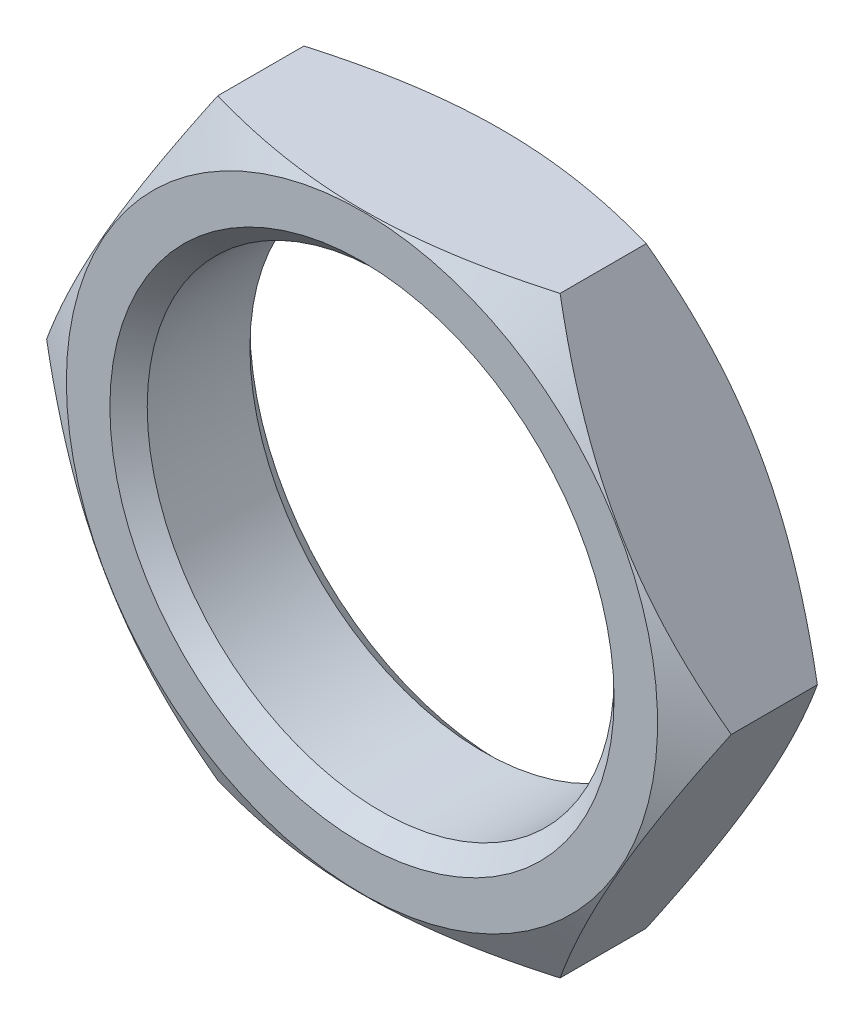
ISO-10303-21;
HEADER;
FILE_DESCRIPTION(('STEP AP214'),'2;1');
FILE_NAME('part.step','',(''),(''),'','','');
FILE_SCHEMA(('AUTOMOTIVE_DESIGN { 1 0 10303 214 1 1 1 1 }'));
ENDSEC;
DATA;
#1=APPLICATION_CONTEXT('core data for automotive mechanical design processes');
#2=APPLICATION_PROTOCOL_DEFINITION('international standard','automotive_design',2000,#1);
#3=PRODUCT_CONTEXT('',#1,'mechanical');
#4=PRODUCT('Part','Part','',(#3));
#5=PRODUCT_RELATED_PRODUCT_CATEGORY('part','',(#4));
#6=PRODUCT_DEFINITION_FORMATION('','',#4);
#7=PRODUCT_DEFINITION_CONTEXT('part definition',#1,'design');
#8=PRODUCT_DEFINITION('design','',#6,#7);
#9=PRODUCT_DEFINITION_SHAPE('','',#8);
#10=(LENGTH_UNIT() NAMED_UNIT(*) SI_UNIT(.MILLI.,.METRE.));
#11=(NAMED_UNIT(*) PLANE_ANGLE_UNIT() SI_UNIT($,.RADIAN.));
#12=(NAMED_UNIT(*) SI_UNIT($,.STERADIAN.) SOLID_ANGLE_UNIT());
#13=UNCERTAINTY_MEASURE_WITH_UNIT(LENGTH_MEASURE(1.E-05),#10,'distance_accuracy_value','');
#14=(GEOMETRIC_REPRESENTATION_CONTEXT(3) GLOBAL_UNCERTAINTY_ASSIGNED_CONTEXT((#13)) GLOBAL_UNIT_ASSIGNED_CONTEXT((#10,
#11,#12)) REPRESENTATION_CONTEXT('',''));
#15=CARTESIAN_POINT('',(0.,0.,0.));
#16=DIRECTION('',(0.,0.,1.));
#17=DIRECTION('',(1.,0.,0.));
#18=AXIS2_PLACEMENT_3D('',#15,#16,#17);
#19=CARTESIAN_POINT('',(3.66617420935412,0.,1.5));
#20=DIRECTION('',(0.,0.,1.));
#21=DIRECTION('',(1.,0.,0.));
#22=AXIS2_PLACEMENT_3D('',#19,#20,#21);
#23=PLANE('',#22);
#24=CARTESIAN_POINT('',(0.,0.,1.5));
#25=DIRECTION('',(0.,0.,1.));
#26=DIRECTION('',(1.,0.,0.));
#27=AXIS2_PLACEMENT_3D('',#24,#25,#26);
#28=CIRCLE('',#27,2.7);
#29=CARTESIAN_POINT('',(2.7,0.,1.5));
#30=VERTEX_POINT('',#29);
#31=EDGE_CURVE('E43',#30,#30,#28,.F.);
#32=ORIENTED_EDGE('',*,*,#31,.T.);
#33=EDGE_LOOP('',(#32));
#34=FACE_BOUND('',#33,.T.);
#35=CARTESIAN_POINT('',(0.,0.,1.5));
#36=DIRECTION('',(0.,0.,-1.));
#37=DIRECTION('',(-1.,0.,0.));
#38=AXIS2_PLACEMENT_3D('',#35,#36,#37);
#39=CIRCLE('',#38,3.16617420935412);
#40=CARTESIAN_POINT('',(-3.16617420935412,0.,1.5));
#41=VERTEX_POINT('',#40);
#42=EDGE_CURVE('E290',#41,#41,#39,.T.);
#43=ORIENTED_EDGE('',*,*,#42,.F.);
#44=EDGE_LOOP('',(#43));
#45=FACE_BOUND('',#44,.T.);
#46=ADVANCED_FACE('F35',(#34,#45),#23,.T.);
#47=CARTESIAN_POINT('',(3.66617420935412,0.,0.));
#48=DIRECTION('',(0.,0.,1.));
#49=DIRECTION('',(1.,0.,0.));
#50=AXIS2_PLACEMENT_3D('',#47,#48,#49);
#51=PLANE('',#50);
#52=CARTESIAN_POINT('',(0.,0.,0.));
#53=DIRECTION('',(0.,0.,1.));
#54=DIRECTION('',(1.,0.,0.));
#55=AXIS2_PLACEMENT_3D('',#52,#53,#54);
#56=CIRCLE('',#55,2.7);
#57=CARTESIAN_POINT('',(-2.7,0.,0.));
#58=VERTEX_POINT('',#57);
#59=EDGE_CURVE('E11',#58,#58,#56,.T.);
#60=ORIENTED_EDGE('',*,*,#59,.T.);
#61=EDGE_LOOP('',(#60));
#62=FACE_BOUND('',#61,.T.);
#63=CARTESIAN_POINT('',(0.,0.,0.));
#64=DIRECTION('',(0.,0.,-1.));
#65=DIRECTION('',(-1.,0.,0.));
#66=AXIS2_PLACEMENT_3D('',#63,#64,#65);
#67=CIRCLE('',#66,3.16617420935412);
#68=CARTESIAN_POINT('',(-3.16617420935412,0.,0.));
#69=VERTEX_POINT('',#68);
#70=EDGE_CURVE('E103',#69,#69,#67,.T.);
#71=ORIENTED_EDGE('',*,*,#70,.T.);
#72=EDGE_LOOP('',(#71));
#73=FACE_BOUND('',#72,.T.);
#74=ADVANCED_FACE('F142',(#62,#73),#51,.F.);
#75=CARTESIAN_POINT('',(0.,0.,1.5));
#76=DIRECTION('',(0.,0.,-1.));
#77=DIRECTION('',(-1.,0.,0.));
#78=AXIS2_PLACEMENT_3D('',#75,#76,#77);
#79=CYLINDRICAL_SURFACE('',#78,2.5);
#80=CARTESIAN_POINT('',(0.,0.,1.3));
#81=DIRECTION('',(0.,0.,1.));
#82=DIRECTION('',(1.,0.,0.));
#83=AXIS2_PLACEMENT_3D('',#80,#81,#82);
#84=CIRCLE('',#83,2.5);
#85=CARTESIAN_POINT('',(2.5,0.,1.3));
#86=VERTEX_POINT('',#85);
#87=EDGE_CURVE('E228',#86,#86,#84,.T.);
#88=ORIENTED_EDGE('',*,*,#87,.T.);
#89=EDGE_LOOP('',(#88));
#90=FACE_BOUND('',#89,.T.);
#91=CARTESIAN_POINT('',(0.,0.,0.199999999999999));
#92=DIRECTION('',(0.,0.,1.));
#93=DIRECTION('',(1.,0.,0.));
#94=AXIS2_PLACEMENT_3D('',#91,#92,#93);
#95=CIRCLE('',#94,2.5);
#96=CARTESIAN_POINT('',(-2.5,0.,0.199999999999999));
#97=VERTEX_POINT('',#96);
#98=EDGE_CURVE('E226',#97,#97,#95,.F.);
#99=ORIENTED_EDGE('',*,*,#98,.T.);
#100=EDGE_LOOP('',(#99));
#101=FACE_BOUND('',#100,.T.);
#102=ADVANCED_FACE('F176',(#90,#101),#79,.F.);
#103=CARTESIAN_POINT('',(0.,0.,1.5));
#104=DIRECTION('',(0.,0.,-1.));
#105=DIRECTION('',(-1.,0.,0.));
#106=AXIS2_PLACEMENT_3D('',#103,#104,#105);
#107=CONICAL_SURFACE('',#106,3.16617420935412,1.0471975511966);
#108=ORIENTED_EDGE('',*,*,#42,.T.);
#109=EDGE_LOOP('',(#108));
#110=FACE_BOUND('',#109,.T.);
#111=CARTESIAN_POINT('',(1.83297163462322,3.1752,1.21125819558902));
#112=CARTESIAN_POINT('',(1.91352665998975,3.03567460326018,1.25778449337159));
#113=CARTESIAN_POINT('',(1.99477703088899,2.89494483272887,1.30009856248647));
#114=CARTESIAN_POINT('',(2.15868472735379,2.61104837470026,1.37395841868651));
#115=CARTESIAN_POINT('',(2.24134496547055,2.46787664251628,1.40547807648575));
#116=CARTESIAN_POINT('',(2.40564101629245,2.18330753500984,1.45454332241152));
#117=CARTESIAN_POINT('',(2.48725154909053,2.04195394577081,1.47241546049167));
#118=CARTESIAN_POINT('',(2.65085664790703,1.7585816022433,1.4937516133625));
#119=CARTESIAN_POINT('',(2.73285061920892,1.61656387803408,1.49723329576289));
#120=CARTESIAN_POINT('',(2.88606277807967,1.35119263453263,1.48999272667258));
#121=CARTESIAN_POINT('',(2.95730389328231,1.22779940341379,1.48104828125116));
#122=CARTESIAN_POINT('',(3.09932198517025,0.981816852669884,1.45269885102635));
#123=CARTESIAN_POINT('',(3.17009847059057,0.859228383940738,1.43328418068489));
#124=CARTESIAN_POINT('',(3.31240941048281,0.612738605574497,1.38474869658357));
#125=CARTESIAN_POINT('',(3.38392585192423,0.488868495421442,1.35542212892199));
#126=CARTESIAN_POINT('',(3.52589204292736,0.242975839646995,1.28886223373264));
#127=CARTESIAN_POINT('',(3.59634361148865,0.120950143425913,1.25164454694488));
#128=CARTESIAN_POINT('',(3.66628967940796,-0.00020000000000055,1.21125819558902));
#129=B_SPLINE_CURVE_WITH_KNOTS('',3,(#111,#112,#113,#114,#115,#116,#117,#118,#119,#120,#121,
#122,#123,#124,#125,#126,#127,#128),.UNSPECIFIED.,.F.,.F.,(4,2,2,2,2,2,2,2,4),(0.,
0.503278731073367,1.00776724301492,1.49976968502821,1.9911679005965,2.41904879402148,
2.84732618162394,3.28510386250597,3.72202181665389),.UNSPECIFIED.);
#130=CARTESIAN_POINT('',(1.83308710467706,3.175,1.21132486540519));
#131=VERTEX_POINT('',#130);
#132=CARTESIAN_POINT('',(3.66617420935412,0.,1.21132486540519));
#133=VERTEX_POINT('',#132);
#134=EDGE_CURVE('E206',#131,#133,#129,.T.);
#135=ORIENTED_EDGE('',*,*,#134,.F.);
#136=CARTESIAN_POINT('',(-4.86091041383428,3.175,-0.0240762402801174));
#137=CARTESIAN_POINT('',(-4.7215154612741,3.175,0.043284165315132));
#138=CARTESIAN_POINT('',(-4.58179085298365,3.175,0.10997473608026));
#139=CARTESIAN_POINT('',(-4.30150407662057,3.175,0.241633424759619));
#140=CARTESIAN_POINT('',(-4.16094176855103,3.175,0.30660124428373));
#141=CARTESIAN_POINT('',(-3.87804168910478,3.175,0.434774055557523));
#142=CARTESIAN_POINT('',(-3.735698360176,3.175,0.497966825121156));
#143=CARTESIAN_POINT('',(-3.44984150385776,3.175,0.621637063138748));
#144=CARTESIAN_POINT('',(-3.30632803795354,3.175,0.682114673188982));
#145=CARTESIAN_POINT('',(-3.01612433694176,3.175,0.80034920340672));
#146=CARTESIAN_POINT('',(-2.86941672371622,3.175,0.858063703437516));
#147=CARTESIAN_POINT('',(-2.57427081677752,3.175,0.968970750600891));
#148=CARTESIAN_POINT('',(-2.42583233256474,3.175,1.02216279454708));
#149=CARTESIAN_POINT('',(-2.12729363863375,3.175,1.12259515745607));
#150=CARTESIAN_POINT('',(-1.97719773171592,3.175,1.16984813591141));
#151=CARTESIAN_POINT('',(-1.67487214241418,3.175,1.25686728648058));
#152=CARTESIAN_POINT('',(-1.52264315144478,3.175,1.29663582691165));
#153=CARTESIAN_POINT('',(-1.2159471316317,3.175,1.36675506541402));
#154=CARTESIAN_POINT('',(-1.0614795097248,3.175,1.39710321824823));
#155=CARTESIAN_POINT('',(-0.750682709592985,3.175,1.44633774116773));
#156=CARTESIAN_POINT('',(-0.594353529595535,3.175,1.46522410033849));
#157=CARTESIAN_POINT('',(-0.281641176422813,3.175,1.48986423478163));
#158=CARTESIAN_POINT('',(-0.125264718727338,3.175,1.49570107573101));
#159=CARTESIAN_POINT('',(0.187377526619472,3.175,1.49393239635516));
#160=CARTESIAN_POINT('',(0.343643332454463,3.175,1.48633036175017));
#161=CARTESIAN_POINT('',(0.610512091704035,3.175,1.46240625391657));
#162=CARTESIAN_POINT('',(0.721409514160021,3.175,1.44919489706695));
#163=CARTESIAN_POINT('',(0.942347234182232,3.175,1.41686351874806));
#164=CARTESIAN_POINT('',(1.05238739367239,3.175,1.39774256482128));
#165=CARTESIAN_POINT('',(1.38113253045761,3.175,1.33251887527632));
#166=CARTESIAN_POINT('',(1.59829601907075,3.175,1.27857212115599));
#167=CARTESIAN_POINT('',(1.92324677799435,3.175,1.18553455638346));
#168=CARTESIAN_POINT('',(2.03272800096451,3.175,1.15202841118178));
#169=CARTESIAN_POINT('',(2.25054773876275,3.175,1.08170217070278));
#170=CARTESIAN_POINT('',(2.35888698513115,3.175,1.04488436173303));
#171=CARTESIAN_POINT('',(2.57396972009902,3.175,0.968700788498143));
#172=CARTESIAN_POINT('',(2.68071875863294,3.175,0.929350534942818));
#173=CARTESIAN_POINT('',(2.89338873406163,3.175,0.848341353682371));
#174=CARTESIAN_POINT('',(2.99930931600647,3.175,0.806681492293712));
#175=CARTESIAN_POINT('',(3.10484697894996,3.175,0.764094773704846));
#176=B_SPLINE_CURVE_WITH_KNOTS('',3,(#136,#137,#138,#139,#140,#141,#142,#143,#144,#145,#146,
#147,#148,#149,#150,#151,#152,#153,#154,#155,#156,#157,#158,#159,#160,#161,#162,#163,#164,#165,
#166,#167,#168,#169,#170,#171,#172,#173,#174,#175),.UNSPECIFIED.,.F.,.F.,(4,2,2,2,2,2,2,2,2,2,2,
2,2,2,2,2,2,2,2,4),(0.,0.464457951286559,0.928995830654614,1.39619330727101,1.86336639104806,
2.33626415307525,2.80921446291247,3.28113890663494,3.75291376625491,4.22481598112261,
4.69671864536045,5.16560879340936,5.63437734050536,5.96925857631251,6.30419267901977,
6.97455961732826,7.31801338200917,7.66123182669723,8.00251810086595,8.34394336421905),.UNSPECIFIED.);
#177=CARTESIAN_POINT('',(-1.83308710467706,3.175,1.21132486540519));
#178=VERTEX_POINT('',#177);
#179=EDGE_CURVE('E89',#178,#131,#176,.T.);
#180=ORIENTED_EDGE('',*,*,#179,.F.);
#181=CARTESIAN_POINT('',(-3.66628967940796,-0.000199999999999124,1.21125819558902));
#182=CARTESIAN_POINT('',(-3.58573465404144,0.139325396739819,1.25778449337159));
#183=CARTESIAN_POINT('',(-3.50448428314219,0.28005516727113,1.30009856248647));
#184=CARTESIAN_POINT('',(-3.34057658667739,0.563951625299742,1.37395841868651));
#185=CARTESIAN_POINT('',(-3.25791634856063,0.707123357483718,1.40547807648575));
#186=CARTESIAN_POINT('',(-3.09362029773873,0.991692464990167,1.45454332241152));
#187=CARTESIAN_POINT('',(-3.01200976494065,1.1330460542292,1.47241546049167));
#188=CARTESIAN_POINT('',(-2.84840466612415,1.41641839775671,1.49375161336249));
#189=CARTESIAN_POINT('',(-2.76641069482226,1.55843612196593,1.49723329576289));
#190=CARTESIAN_POINT('',(-2.61319853595151,1.82380736546737,1.48999272667258));
#191=CARTESIAN_POINT('',(-2.54195742074888,1.94720059658621,1.48104828125116));
#192=CARTESIAN_POINT('',(-2.39993932886093,2.19318314733012,1.45269885102635));
#193=CARTESIAN_POINT('',(-2.32916284344061,2.31577161605926,1.43328418068489));
#194=CARTESIAN_POINT('',(-2.18685190354837,2.5622613944255,1.38474869658357));
#195=CARTESIAN_POINT('',(-2.11533546210696,2.68613150457856,1.35542212892199));
#196=CARTESIAN_POINT('',(-1.97336927110383,2.93202416035301,1.28886223373264));
#197=CARTESIAN_POINT('',(-1.90291770254254,3.05404985657409,1.25164454694488));
#198=CARTESIAN_POINT('',(-1.83297163462322,3.1752,1.21125819558902));
#199=B_SPLINE_CURVE_WITH_KNOTS('',3,(#181,#182,#183,#184,#185,#186,#187,#188,#189,#190,#191,
#192,#193,#194,#195,#196,#197,#198),.UNSPECIFIED.,.F.,.F.,(4,2,2,2,2,2,2,2,4),(0.,
0.503278731073367,1.00776724301492,1.49976968502821,1.9911679005965,2.41904879402148,
2.84732618162394,3.28510386250597,3.72202181665388),.UNSPECIFIED.);
#200=CARTESIAN_POINT('',(-3.66617420935412,0.,1.21132486540519));
#201=VERTEX_POINT('',#200);
#202=EDGE_CURVE('E86',#201,#178,#199,.T.);
#203=ORIENTED_EDGE('',*,*,#202,.F.);
#204=CARTESIAN_POINT('',(-1.83297163462322,-3.1752,1.21125819558902));
#205=CARTESIAN_POINT('',(-1.91352665998975,-3.03567460326018,1.25778449337159));
#206=CARTESIAN_POINT('',(-1.99477703088899,-2.89494483272887,1.30009856248647));
#207=CARTESIAN_POINT('',(-2.15868472735379,-2.61104837470026,1.37395841868651));
#208=CARTESIAN_POINT('',(-2.24134496547056,-2.46787664251628,1.40547807648575));
#209=CARTESIAN_POINT('',(-2.40564101629246,-2.18330753500983,1.45454332241152));
#210=CARTESIAN_POINT('',(-2.48725154909053,-2.0419539457708,1.47241546049167));
#211=CARTESIAN_POINT('',(-2.65085664790703,-1.7585816022433,1.4937516133625));
#212=CARTESIAN_POINT('',(-2.73285061920892,-1.61656387803407,1.49723329576289));
#213=CARTESIAN_POINT('',(-2.88606277807967,-1.35119263453263,1.48999272667258));
#214=CARTESIAN_POINT('',(-2.95730389328231,-1.22779940341379,1.48104828125116));
#215=CARTESIAN_POINT('',(-3.09932198517026,-0.981816852669883,1.45269885102635));
#216=CARTESIAN_POINT('',(-3.17009847059057,-0.859228383940737,1.43328418068489));
#217=CARTESIAN_POINT('',(-3.31240941048281,-0.612738605574497,1.38474869658357));
#218=CARTESIAN_POINT('',(-3.38392585192423,-0.488868495421441,1.35542212892199));
#219=CARTESIAN_POINT('',(-3.52589204292736,-0.242975839646994,1.28886223373264));
#220=CARTESIAN_POINT('',(-3.59634361148865,-0.120950143425912,1.25164454694488));
#221=CARTESIAN_POINT('',(-3.66628967940796,0.000200000000000771,1.21125819558902));
#222=B_SPLINE_CURVE_WITH_KNOTS('',3,(#204,#205,#206,#207,#208,#209,#210,#211,#212,#213,#214,
#215,#216,#217,#218,#219,#220,#221),.UNSPECIFIED.,.F.,.F.,(4,2,2,2,2,2,2,2,4),(0.,
0.503278731073367,1.00776724301492,1.49976968502821,1.9911679005965,2.41904879402148,
2.84732618162394,3.28510386250597,3.72202181665388),.UNSPECIFIED.);
#223=CARTESIAN_POINT('',(-1.83308710467706,-3.175,1.21132486540519));
#224=VERTEX_POINT('',#223);
#225=EDGE_CURVE('E50',#224,#201,#222,.T.);
#226=ORIENTED_EDGE('',*,*,#225,.F.);
#227=CARTESIAN_POINT('',(-4.86091181597819,-3.175,-0.0240769180405028));
#228=CARTESIAN_POINT('',(-4.72151681542077,-3.175,0.043283516555752));
#229=CARTESIAN_POINT('',(-4.58179215909639,-3.175,0.109974116304845));
#230=CARTESIAN_POINT('',(-4.3015052865048,-3.175,0.241632862797772));
#231=CARTESIAN_POINT('',(-4.16094293024067,-3.175,0.306600711151463));
#232=CARTESIAN_POINT('',(-3.87804275359891,-3.175,0.434773580099077));
#233=CARTESIAN_POINT('',(-3.73569937566585,-3.175,0.497966378500803));
#234=CARTESIAN_POINT('',(-3.44984242097442,-3.175,0.621636673663793));
#235=CARTESIAN_POINT('',(-3.30632890570133,-3.175,0.68211431202139));
#236=CARTESIAN_POINT('',(-3.01612510462571,-3.175,0.800348898365044));
#237=CARTESIAN_POINT('',(-2.86941744069677,-3.175,0.858063426199321));
#238=CARTESIAN_POINT('',(-2.57427143150234,-3.175,0.968970527427298));
#239=CARTESIAN_POINT('',(-2.42583289573701,-3.175,1.02216259763406));
#240=CARTESIAN_POINT('',(-2.12729409772695,-3.175,1.12259501044893));
#241=CARTESIAN_POINT('',(-1.97719813828615,-3.175,1.16984801255811));
#242=CARTESIAN_POINT('',(-1.67487244249251,-3.175,1.25686720643144));
#243=CARTESIAN_POINT('',(-1.52264339755504,-3.175,1.29663576651543));
#244=CARTESIAN_POINT('',(-1.21594723993683,-3.175,1.36675504477664));
#245=CARTESIAN_POINT('',(-1.061479533789,-3.175,1.39710321598389));
#246=CARTESIAN_POINT('',(-0.75068256328391,-3.175,1.4463377628004));
#247=CARTESIAN_POINT('',(-0.594353297155605,-3.175,1.46522412750434));
#248=CARTESIAN_POINT('',(-0.281640772137679,-3.175,1.48986425785309));
#249=CARTESIAN_POINT('',(-0.125264228733489,-3.175,1.49570108930151));
#250=CARTESIAN_POINT('',(0.187378186571178,-3.175,1.49393237629073));
#251=CARTESIAN_POINT('',(0.343644076655669,-3.175,1.48633031754848));
#252=CARTESIAN_POINT('',(0.610512943644619,-3.175,1.46240616139379));
#253=CARTESIAN_POINT('',(0.72141039052701,-3.175,1.44919478520216));
#254=CARTESIAN_POINT('',(0.942348158376267,-3.175,1.41686336713381));
#255=CARTESIAN_POINT('',(1.05238834126691,-3.175,1.3977423927994));
#256=CARTESIAN_POINT('',(1.38113354712772,-3.175,1.33251864153517));
#257=CARTESIAN_POINT('',(1.59829708014411,-3.175,1.2785718456476));
#258=CARTESIAN_POINT('',(1.92324790543182,-3.175,1.18553421909022));
#259=CARTESIAN_POINT('',(2.0327291508897,-3.175,1.15202805314487));
#260=CARTESIAN_POINT('',(2.2505489334083,-3.175,1.08170177177666));
#261=CARTESIAN_POINT('',(2.35888820200968,-3.175,1.04488394266165));
#262=CARTESIAN_POINT('',(2.5739709811214,-3.175,0.968700329924556));
#263=CARTESIAN_POINT('',(2.68072004156769,-3.175,0.929350057011721));
#264=CARTESIAN_POINT('',(2.89339006086902,-3.175,0.848340837618876));
#265=CARTESIAN_POINT('',(2.9993106647738,-3.175,0.806680957454716));
#266=CARTESIAN_POINT('',(3.10484834971432,-3.175,0.764094220378609));
#267=B_SPLINE_CURVE_WITH_KNOTS('',3,(#227,#228,#229,#230,#231,#232,#233,#234,#235,#236,#237,
#238,#239,#240,#241,#242,#243,#244,#245,#246,#247,#248,#249,#250,#251,#252,#253,#254,#255,#256,
#257,#258,#259,#260,#261,#262,#263,#264,#265,#266),.UNSPECIFIED.,.F.,.F.,(4,2,2,2,2,2,2,2,2,2,2,
2,2,2,2,2,2,2,2,4),(0.,0.464458118790213,0.928996165689723,1.39619381177686,1.86336706501107,
2.33626499910908,2.80921548107529,3.28114009630672,3.75291512729647,4.22481760019562,
4.69672052208508,5.16561092503953,5.63437972722124,5.96926104264035,6.30419522497277,
6.97456232297822,7.3180161704092,7.66123469772175,8.00252105367554,8.34394639897521),.UNSPECIFIED.);
#268=CARTESIAN_POINT('',(1.83308710467707,-3.175,1.21132486540519));
#269=VERTEX_POINT('',#268);
#270=EDGE_CURVE('E121',#269,#224,#267,.F.);
#271=ORIENTED_EDGE('',*,*,#270,.F.);
#272=CARTESIAN_POINT('',(3.66628967940796,0.000199999999999133,1.21125819558902));
#273=CARTESIAN_POINT('',(3.58573465404144,-0.139325396739819,1.25778449337159));
#274=CARTESIAN_POINT('',(3.50448428314219,-0.280055167271129,1.30009856248647));
#275=CARTESIAN_POINT('',(3.34057658667739,-0.563951625299742,1.37395841868651));
#276=CARTESIAN_POINT('',(3.25791634856063,-0.707123357483718,1.40547807648575));
#277=CARTESIAN_POINT('',(3.09362029773873,-0.991692464990166,1.45454332241152));
#278=CARTESIAN_POINT('',(3.01200976494065,-1.1330460542292,1.47241546049167));
#279=CARTESIAN_POINT('',(2.84840466612415,-1.41641839775671,1.49375161336249));
#280=CARTESIAN_POINT('',(2.76641069482226,-1.55843612196593,1.49723329576289));
#281=CARTESIAN_POINT('',(2.61319853595151,-1.82380736546737,1.48999272667258));
#282=CARTESIAN_POINT('',(2.54195742074888,-1.94720059658621,1.48104828125116));
#283=CARTESIAN_POINT('',(2.39993932886093,-2.19318314733012,1.45269885102635));
#284=CARTESIAN_POINT('',(2.32916284344061,-2.31577161605926,1.43328418068489));
#285=CARTESIAN_POINT('',(2.18685190354837,-2.5622613944255,1.38474869658357));
#286=CARTESIAN_POINT('',(2.11533546210696,-2.68613150457856,1.35542212892199));
#287=CARTESIAN_POINT('',(1.97336927110383,-2.932024160353,1.28886223373264));
#288=CARTESIAN_POINT('',(1.90291770254254,-3.05404985657409,1.25164454694488));
#289=CARTESIAN_POINT('',(1.83297163462323,-3.1752,1.21125819558902));
#290=B_SPLINE_CURVE_WITH_KNOTS('',3,(#272,#273,#274,#275,#276,#277,#278,#279,#280,#281,#282,
#283,#284,#285,#286,#287,#288,#289),.UNSPECIFIED.,.F.,.F.,(4,2,2,2,2,2,2,2,4),(0.,
0.503278731073367,1.00776724301492,1.49976968502821,1.9911679005965,2.41904879402148,
2.84732618162393,3.28510386250597,3.72202181665388),.UNSPECIFIED.);
#291=EDGE_CURVE('E162',#133,#269,#290,.T.);
#292=ORIENTED_EDGE('',*,*,#291,.F.);
#293=EDGE_LOOP('',(#135,#180,#203,#226,#271,#292));
#294=FACE_BOUND('',#293,.T.);
#295=ADVANCED_FACE('F87',(#110,#294),#107,.T.);
#296=CARTESIAN_POINT('',(0.,0.,0.288675134594809));
#297=DIRECTION('',(0.,0.,1.));
#298=DIRECTION('',(1.,0.,0.));
#299=AXIS2_PLACEMENT_3D('',#296,#297,#298);
#300=CONICAL_SURFACE('',#299,3.66617420935412,1.0471975511966);
#301=ORIENTED_EDGE('',*,*,#70,.F.);
#302=EDGE_LOOP('',(#301));
#303=FACE_BOUND('',#302,.T.);
#304=CARTESIAN_POINT('',(-4.86091181597819,-3.175,1.5240769180405));
#305=CARTESIAN_POINT('',(-4.72151681542077,-3.175,1.45671648344425));
#306=CARTESIAN_POINT('',(-4.58179215909639,-3.175,1.39002588369516));
#307=CARTESIAN_POINT('',(-4.3015052865048,-3.175,1.25836713720223));
#308=CARTESIAN_POINT('',(-4.16094293024067,-3.175,1.19339928884854));
#309=CARTESIAN_POINT('',(-3.87804275359891,-3.175,1.06522641990092));
#310=CARTESIAN_POINT('',(-3.73569937566585,-3.175,1.0020336214992));
#311=CARTESIAN_POINT('',(-3.44984242097442,-3.175,0.878363326336207));
#312=CARTESIAN_POINT('',(-3.30632890570133,-3.175,0.817885687978611));
#313=CARTESIAN_POINT('',(-3.01612510462571,-3.175,0.699651101634956));
#314=CARTESIAN_POINT('',(-2.86941744069677,-3.175,0.641936573800679));
#315=CARTESIAN_POINT('',(-2.57427143150234,-3.175,0.531029472572702));
#316=CARTESIAN_POINT('',(-2.42583289573701,-3.175,0.477837402365943));
#317=CARTESIAN_POINT('',(-2.12729409772694,-3.175,0.377404989551071));
#318=CARTESIAN_POINT('',(-1.97719813828615,-3.175,0.330151987441886));
#319=CARTESIAN_POINT('',(-1.67487244249251,-3.175,0.24313279356856));
#320=CARTESIAN_POINT('',(-1.52264339755504,-3.175,0.203364233484572));
#321=CARTESIAN_POINT('',(-1.21594723993683,-3.175,0.133244955223363));
#322=CARTESIAN_POINT('',(-1.061479533789,-3.175,0.102896784016114));
#323=CARTESIAN_POINT('',(-0.75068256328391,-3.175,0.0536622371996));
#324=CARTESIAN_POINT('',(-0.594353297155606,-3.175,0.0347758724956576));
#325=CARTESIAN_POINT('',(-0.281640772137679,-3.175,0.010135742146913));
#326=CARTESIAN_POINT('',(-0.125264228733489,-3.175,0.00429891069848529));
#327=CARTESIAN_POINT('',(0.187378186571178,-3.175,0.00606762370927013));
#328=CARTESIAN_POINT('',(0.343644076655669,-3.175,0.0136696824515233));
#329=CARTESIAN_POINT('',(0.610512943644619,-3.175,0.0375938386062125));
#330=CARTESIAN_POINT('',(0.721410390527011,-3.175,0.0508052147978355));
#331=CARTESIAN_POINT('',(0.942348158376268,-3.175,0.0831366328661899));
#332=CARTESIAN_POINT('',(1.05238834126691,-3.175,0.102257607200602));
#333=CARTESIAN_POINT('',(1.38113354712772,-3.175,0.167481358464831));
#334=CARTESIAN_POINT('',(1.59829708014411,-3.175,0.221428154352405));
#335=CARTESIAN_POINT('',(1.92324790543182,-3.175,0.314465780909778));
#336=CARTESIAN_POINT('',(2.0327291508897,-3.175,0.347971946855127));
#337=CARTESIAN_POINT('',(2.2505489334083,-3.175,0.418298228223342));
#338=CARTESIAN_POINT('',(2.35888820200968,-3.175,0.455116057338349));
#339=CARTESIAN_POINT('',(2.5739709811214,-3.175,0.531299670075444));
#340=CARTESIAN_POINT('',(2.68072004156769,-3.175,0.57064994298828));
#341=CARTESIAN_POINT('',(2.89339006086902,-3.175,0.651659162381125));
#342=CARTESIAN_POINT('',(2.9993106647738,-3.175,0.693319042545285));
#343=CARTESIAN_POINT('',(3.10484834971432,-3.175,0.735905779621392));
#344=B_SPLINE_CURVE_WITH_KNOTS('',3,(#304,#305,#306,#307,#308,#309,#310,#311,#312,#313,#314,
#315,#316,#317,#318,#319,#320,#321,#322,#323,#324,#325,#326,#327,#328,#329,#330,#331,#332,#333,
#334,#335,#336,#337,#338,#339,#340,#341,#342,#343),.UNSPECIFIED.,.F.,.F.,(4,2,2,2,2,2,2,2,2,2,2,
2,2,2,2,2,2,2,2,4),(0.,0.464458118790213,0.928996165689725,1.39619381177686,1.86336706501108,
2.33626499910908,2.80921548107529,3.28114009630673,3.75291512729648,4.22481760019562,
4.69672052208508,5.16561092503953,5.63437972722125,5.96926104264036,6.30419522497277,
6.97456232297823,7.31801617040921,7.66123469772175,8.00252105367555,8.34394639897521),.UNSPECIFIED.);
#345=CARTESIAN_POINT('',(-1.83308710467707,-3.175,0.288675134594809));
#346=VERTEX_POINT('',#345);
#347=CARTESIAN_POINT('',(1.83308710467706,-3.175,0.288675134594809));
#348=VERTEX_POINT('',#347);
#349=EDGE_CURVE('E128',#346,#348,#344,.T.);
#350=ORIENTED_EDGE('',*,*,#349,.F.);
#351=CARTESIAN_POINT('',(-3.66628967940796,0.000200000000000924,0.288741804410983));
#352=CARTESIAN_POINT('',(-3.58573465404144,-0.139325396739818,0.242215506628412));
#353=CARTESIAN_POINT('',(-3.50448428314219,-0.280055167271128,0.199901437513528));
#354=CARTESIAN_POINT('',(-3.34057658667739,-0.56395162529974,0.126041581313493));
#355=CARTESIAN_POINT('',(-3.25791634856063,-0.707123357483716,0.0945219235142495));
#356=CARTESIAN_POINT('',(-3.09362029773873,-0.991692464990165,0.0454566775884788));
#357=CARTESIAN_POINT('',(-3.01200976494065,-1.1330460542292,0.0275845395083342));
#358=CARTESIAN_POINT('',(-2.84840466612415,-1.4164183977567,0.00624838663750476));
#359=CARTESIAN_POINT('',(-2.76641069482226,-1.55843612196593,0.00276670423710596));
#360=CARTESIAN_POINT('',(-2.61319853595151,-1.82380736546737,0.0100072733274201));
#361=CARTESIAN_POINT('',(-2.54195742074888,-1.94720059658621,0.0189517187488377));
#362=CARTESIAN_POINT('',(-2.39993932886093,-2.19318314733012,0.0473011489736503));
#363=CARTESIAN_POINT('',(-2.32916284344061,-2.31577161605926,0.066715819315112));
#364=CARTESIAN_POINT('',(-2.18685190354837,-2.5622613944255,0.115251303416427));
#365=CARTESIAN_POINT('',(-2.11533546210696,-2.68613150457856,0.144577871078009));
#366=CARTESIAN_POINT('',(-1.97336927110383,-2.93202416035301,0.211137766267362));
#367=CARTESIAN_POINT('',(-1.90291770254254,-3.05404985657409,0.248355453055117));
#368=CARTESIAN_POINT('',(-1.83297163462322,-3.1752,0.288741804410982));
#369=B_SPLINE_CURVE_WITH_KNOTS('',3,(#351,#352,#353,#354,#355,#356,#357,#358,#359,#360,#361,
#362,#363,#364,#365,#366,#367,#368),.UNSPECIFIED.,.F.,.F.,(4,2,2,2,2,2,2,2,4),(0.,
0.503278731073367,1.00776724301492,1.49976968502821,1.9911679005965,2.41904879402148,
2.84732618162394,3.28510386250597,3.72202181665388),.UNSPECIFIED.);
#370=CARTESIAN_POINT('',(-3.66617420935412,0.,0.288675134594809));
#371=VERTEX_POINT('',#370);
#372=EDGE_CURVE('E156',#371,#346,#369,.T.);
#373=ORIENTED_EDGE('',*,*,#372,.F.);
#374=CARTESIAN_POINT('',(-1.83297163462322,3.1752,0.288741804410982));
#375=CARTESIAN_POINT('',(-1.91352665998975,3.03567460326018,0.242215506628413));
#376=CARTESIAN_POINT('',(-1.99477703088899,2.89494483272887,0.199901437513528));
#377=CARTESIAN_POINT('',(-2.1586847273538,2.61104837470026,0.126041581313493));
#378=CARTESIAN_POINT('',(-2.24134496547056,2.46787664251628,0.0945219235142496));
#379=CARTESIAN_POINT('',(-2.40564101629246,2.18330753500983,0.0454566775884791));
#380=CARTESIAN_POINT('',(-2.48725154909053,2.0419539457708,0.0275845395083346));
#381=CARTESIAN_POINT('',(-2.65085664790703,1.7585816022433,0.00624838663750542));
#382=CARTESIAN_POINT('',(-2.73285061920893,1.61656387803407,0.00276670423710666));
#383=CARTESIAN_POINT('',(-2.88606277807967,1.35119263453263,0.0100072733274209));
#384=CARTESIAN_POINT('',(-2.95730389328231,1.22779940341379,0.0189517187488384));
#385=CARTESIAN_POINT('',(-3.09932198517026,0.981816852669884,0.0473011489736513));
#386=CARTESIAN_POINT('',(-3.17009847059057,0.859228383940737,0.0667158193151134));
#387=CARTESIAN_POINT('',(-3.31240941048281,0.612738605574497,0.115251303416429));
#388=CARTESIAN_POINT('',(-3.38392585192423,0.488868495421442,0.144577871078011));
#389=CARTESIAN_POINT('',(-3.52589204292736,0.242975839646996,0.211137766267363));
#390=CARTESIAN_POINT('',(-3.59634361148865,0.120950143425914,0.248355453055118));
#391=CARTESIAN_POINT('',(-3.66628967940796,-0.000199999999998712,0.288741804410982));
#392=B_SPLINE_CURVE_WITH_KNOTS('',3,(#374,#375,#376,#377,#378,#379,#380,#381,#382,#383,#384,
#385,#386,#387,#388,#389,#390,#391),.UNSPECIFIED.,.F.,.F.,(4,2,2,2,2,2,2,2,4),(0.,
0.503278731073366,1.00776724301492,1.49976968502821,1.9911679005965,2.41904879402148,
2.84732618162394,3.28510386250597,3.72202181665388),.UNSPECIFIED.);
#393=CARTESIAN_POINT('',(-1.83308710467706,3.175,0.288675134594809));
#394=VERTEX_POINT('',#393);
#395=EDGE_CURVE('E107',#394,#371,#392,.T.);
#396=ORIENTED_EDGE('',*,*,#395,.F.);
#397=CARTESIAN_POINT('',(-4.86091041383428,3.175,1.52407624028012));
#398=CARTESIAN_POINT('',(-4.7215154612741,3.175,1.45671583468487));
#399=CARTESIAN_POINT('',(-4.58179085298366,3.175,1.39002526391974));
#400=CARTESIAN_POINT('',(-4.30150407662057,3.175,1.25836657524038));
#401=CARTESIAN_POINT('',(-4.16094176855103,3.175,1.19339875571627));
#402=CARTESIAN_POINT('',(-3.87804168910478,3.175,1.06522594444248));
#403=CARTESIAN_POINT('',(-3.735698360176,3.175,1.00203317487884));
#404=CARTESIAN_POINT('',(-3.44984150385776,3.175,0.878362936861252));
#405=CARTESIAN_POINT('',(-3.30632803795354,3.175,0.817885326811018));
#406=CARTESIAN_POINT('',(-3.01612433694176,3.175,0.69965079659328));
#407=CARTESIAN_POINT('',(-2.86941672371622,3.175,0.641936296562484));
#408=CARTESIAN_POINT('',(-2.57427081677752,3.175,0.531029249399108));
#409=CARTESIAN_POINT('',(-2.42583233256474,3.175,0.477837205452923));
#410=CARTESIAN_POINT('',(-2.12729363863375,3.175,0.377404842543934));
#411=CARTESIAN_POINT('',(-1.97719773171592,3.175,0.330151864088589));
#412=CARTESIAN_POINT('',(-1.67487214241418,3.175,0.243132713519416));
#413=CARTESIAN_POINT('',(-1.52264315144478,3.175,0.203364173088346));
#414=CARTESIAN_POINT('',(-1.2159471316317,3.175,0.133244934585981));
#415=CARTESIAN_POINT('',(-1.0614795097248,3.175,0.102896781751768));
#416=CARTESIAN_POINT('',(-0.750682709592985,3.175,0.053662258832265));
#417=CARTESIAN_POINT('',(-0.594353529595535,3.175,0.0347758996615142));
#418=CARTESIAN_POINT('',(-0.281641176422813,3.175,0.0101357652183698));
#419=CARTESIAN_POINT('',(-0.125264718727338,3.175,0.00429892426899344));
#420=CARTESIAN_POINT('',(0.187377526619472,3.175,0.00606760364483628));
#421=CARTESIAN_POINT('',(0.343643332454463,3.175,0.0136696382498324));
#422=CARTESIAN_POINT('',(0.610512091704036,3.175,0.0375937460834316));
#423=CARTESIAN_POINT('',(0.721409514160022,3.175,0.0508051029330488));
#424=CARTESIAN_POINT('',(0.942347234182232,3.175,0.0831364812519434));
#425=CARTESIAN_POINT('',(1.05238739367239,3.175,0.102257435178723));
#426=CARTESIAN_POINT('',(1.38113253045761,3.175,0.167481124723676));
#427=CARTESIAN_POINT('',(1.59829601907075,3.175,0.22142787884401));
#428=CARTESIAN_POINT('',(1.92324677799435,3.175,0.314465443616542));
#429=CARTESIAN_POINT('',(2.03272800096451,3.175,0.347971588818218));
#430=CARTESIAN_POINT('',(2.25054773876275,3.175,0.418297829297224));
#431=CARTESIAN_POINT('',(2.35888698513115,3.175,0.455115638266967));
#432=CARTESIAN_POINT('',(2.57396972009902,3.175,0.531299211501857));
#433=CARTESIAN_POINT('',(2.68071875863294,3.175,0.570649465057182));
#434=CARTESIAN_POINT('',(2.89338873406163,3.175,0.651658646317629));
#435=CARTESIAN_POINT('',(2.99930931600647,3.175,0.693318507706288));
#436=CARTESIAN_POINT('',(3.10484697894996,3.175,0.735905226295154));
#437=B_SPLINE_CURVE_WITH_KNOTS('',3,(#397,#398,#399,#400,#401,#402,#403,#404,#405,#406,#407,
#408,#409,#410,#411,#412,#413,#414,#415,#416,#417,#418,#419,#420,#421,#422,#423,#424,#425,#426,
#427,#428,#429,#430,#431,#432,#433,#434,#435,#436),.UNSPECIFIED.,.F.,.F.,(4,2,2,2,2,2,2,2,2,2,2,
2,2,2,2,2,2,2,2,4),(0.,0.464457951286559,0.928995830654616,1.39619330727102,1.86336639104806,
2.33626415307525,2.80921446291247,3.28113890663494,3.75291376625491,4.22481598112262,
4.69671864536045,5.16560879340937,5.63437734050536,5.96925857631251,6.30419267901977,
6.97455961732826,7.31801338200918,7.66123182669723,8.00251810086595,8.34394336421905),.UNSPECIFIED.);
#438=CARTESIAN_POINT('',(1.83308710467706,3.175,0.288675134594809));
#439=VERTEX_POINT('',#438);
#440=EDGE_CURVE('E183',#439,#394,#437,.F.);
#441=ORIENTED_EDGE('',*,*,#440,.F.);
#442=CARTESIAN_POINT('',(3.66628967940796,-0.000200000000000923,0.288741804410982));
#443=CARTESIAN_POINT('',(3.58573465404144,0.139325396739817,0.242215506628412));
#444=CARTESIAN_POINT('',(3.50448428314219,0.280055167271128,0.199901437513528));
#445=CARTESIAN_POINT('',(3.34057658667739,0.56395162529974,0.126041581313493));
#446=CARTESIAN_POINT('',(3.25791634856063,0.707123357483716,0.0945219235142489));
#447=CARTESIAN_POINT('',(3.09362029773873,0.991692464990165,0.0454566775884781));
#448=CARTESIAN_POINT('',(3.01200976494065,1.1330460542292,0.0275845395083336));
#449=CARTESIAN_POINT('',(2.84840466612415,1.4164183977567,0.00624838663750424));
#450=CARTESIAN_POINT('',(2.76641069482226,1.55843612196592,0.00276670423710548));
#451=CARTESIAN_POINT('',(2.61319853595151,1.82380736546737,0.0100072733274196));
#452=CARTESIAN_POINT('',(2.54195742074887,1.94720059658621,0.0189517187488371));
#453=CARTESIAN_POINT('',(2.39993932886093,2.19318314733012,0.0473011489736498));
#454=CARTESIAN_POINT('',(2.32916284344061,2.31577161605926,0.0667158193151117));
#455=CARTESIAN_POINT('',(2.18685190354837,2.5622613944255,0.115251303416427));
#456=CARTESIAN_POINT('',(2.11533546210696,2.68613150457856,0.144577871078009));
#457=CARTESIAN_POINT('',(1.97336927110383,2.93202416035301,0.211137766267362));
#458=CARTESIAN_POINT('',(1.90291770254253,3.05404985657409,0.248355453055118));
#459=CARTESIAN_POINT('',(1.83297163462322,3.1752,0.288741804410982));
#460=B_SPLINE_CURVE_WITH_KNOTS('',3,(#442,#443,#444,#445,#446,#447,#448,#449,#450,#451,#452,
#453,#454,#455,#456,#457,#458,#459),.UNSPECIFIED.,.F.,.F.,(4,2,2,2,2,2,2,2,4),(0.,
0.503278731073367,1.00776724301492,1.49976968502821,1.9911679005965,2.41904879402148,
2.84732618162394,3.28510386250597,3.72202181665389),.UNSPECIFIED.);
#461=CARTESIAN_POINT('',(3.66617420935412,0.,0.288675134594809));
#462=VERTEX_POINT('',#461);
#463=EDGE_CURVE('E188',#462,#439,#460,.T.);
#464=ORIENTED_EDGE('',*,*,#463,.F.);
#465=CARTESIAN_POINT('',(1.83297163462323,-3.1752,0.288741804410982));
#466=CARTESIAN_POINT('',(1.91352665998975,-3.03567460326018,0.242215506628412));
#467=CARTESIAN_POINT('',(1.99477703088899,-2.89494483272887,0.199901437513528));
#468=CARTESIAN_POINT('',(2.1586847273538,-2.61104837470026,0.126041581313493));
#469=CARTESIAN_POINT('',(2.24134496547056,-2.46787664251628,0.0945219235142491));
#470=CARTESIAN_POINT('',(2.40564101629246,-2.18330753500983,0.0454566775884785));
#471=CARTESIAN_POINT('',(2.48725154909053,-2.0419539457708,0.027584539508334));
#472=CARTESIAN_POINT('',(2.65085664790704,-1.75858160224329,0.00624838663750504));
#473=CARTESIAN_POINT('',(2.73285061920893,-1.61656387803407,0.00276670423710662));
#474=CARTESIAN_POINT('',(2.88606277807967,-1.35119263453263,0.010007273327421));
#475=CARTESIAN_POINT('',(2.95730389328231,-1.22779940341379,0.0189517187488385));
#476=CARTESIAN_POINT('',(3.09932198517026,-0.981816852669882,0.0473011489736512));
#477=CARTESIAN_POINT('',(3.17009847059057,-0.859228383940736,0.0667158193151132));
#478=CARTESIAN_POINT('',(3.31240941048281,-0.612738605574496,0.115251303416429));
#479=CARTESIAN_POINT('',(3.38392585192423,-0.488868495421441,0.14457787107801));
#480=CARTESIAN_POINT('',(3.52589204292736,-0.242975839646995,0.211137766267363));
#481=CARTESIAN_POINT('',(3.59634361148865,-0.120950143425914,0.248355453055118));
#482=CARTESIAN_POINT('',(3.66628967940796,0.000199999999999305,0.288741804410982));
#483=B_SPLINE_CURVE_WITH_KNOTS('',3,(#465,#466,#467,#468,#469,#470,#471,#472,#473,#474,#475,
#476,#477,#478,#479,#480,#481,#482),.UNSPECIFIED.,.F.,.F.,(4,2,2,2,2,2,2,2,4),(0.,
0.503278731073366,1.00776724301492,1.49976968502821,1.9911679005965,2.41904879402148,
2.84732618162393,3.28510386250597,3.72202181665388),.UNSPECIFIED.);
#484=EDGE_CURVE('E58',#348,#462,#483,.T.);
#485=ORIENTED_EDGE('',*,*,#484,.F.);
#486=EDGE_LOOP('',(#350,#373,#396,#441,#464,#485));
#487=FACE_BOUND('',#486,.T.);
#488=ADVANCED_FACE('F140',(#303,#487),#300,.T.);
#489=CARTESIAN_POINT('',(-1.83308710467706,-3.175,1.5));
#490=DIRECTION('',(0.,1.,0.));
#491=DIRECTION('',(-1.,0.,0.));
#492=AXIS2_PLACEMENT_3D('',#489,#490,#491);
#493=PLANE('',#492);
#494=DIRECTION('',(0.,0.,-1.));
#495=VECTOR('',#494,1.);
#496=CARTESIAN_POINT('',(-1.83308710467706,-3.175,1.5));
#497=LINE('',#496,#495);
#498=EDGE_CURVE('E102',#224,#346,#497,.T.);
#499=ORIENTED_EDGE('',*,*,#498,.T.);
#500=ORIENTED_EDGE('',*,*,#349,.T.);
#501=DIRECTION('',(0.,0.,-1.));
#502=VECTOR('',#501,1.);
#503=CARTESIAN_POINT('',(1.83308710467706,-3.175,1.5));
#504=LINE('',#503,#502);
#505=EDGE_CURVE('E112',#269,#348,#504,.T.);
#506=ORIENTED_EDGE('',*,*,#505,.F.);
#507=ORIENTED_EDGE('',*,*,#270,.T.);
#508=EDGE_LOOP('',(#499,#500,#506,#507));
#509=FACE_BOUND('',#508,.T.);
#510=ADVANCED_FACE('F135',(#509),#493,.F.);
#511=CARTESIAN_POINT('',(-3.66617420935412,0.,1.5));
#512=DIRECTION('',(0.866025403784438,0.5,0.));
#513=DIRECTION('',(-0.5,0.866025403784438,0.));
#514=AXIS2_PLACEMENT_3D('',#511,#512,#513);
#515=PLANE('',#514);
#516=DIRECTION('',(0.,0.,-1.));
#517=VECTOR('',#516,1.);
#518=CARTESIAN_POINT('',(-3.66617420935412,0.,1.5));
#519=LINE('',#518,#517);
#520=EDGE_CURVE('E100',#201,#371,#519,.T.);
#521=ORIENTED_EDGE('',*,*,#520,.T.);
#522=ORIENTED_EDGE('',*,*,#372,.T.);
#523=ORIENTED_EDGE('',*,*,#498,.F.);
#524=ORIENTED_EDGE('',*,*,#225,.T.);
#525=EDGE_LOOP('',(#521,#522,#523,#524));
#526=FACE_BOUND('',#525,.T.);
#527=ADVANCED_FACE('F98',(#526),#515,.F.);
#528=CARTESIAN_POINT('',(-1.83308710467706,3.175,1.5));
#529=DIRECTION('',(0.866025403784439,-0.5,0.));
#530=DIRECTION('',(0.5,0.866025403784439,0.));
#531=AXIS2_PLACEMENT_3D('',#528,#529,#530);
#532=PLANE('',#531);
#533=DIRECTION('',(0.,0.,-1.));
#534=VECTOR('',#533,1.);
#535=CARTESIAN_POINT('',(-1.83308710467706,3.175,1.5));
#536=LINE('',#535,#534);
#537=EDGE_CURVE('E108',#178,#394,#536,.T.);
#538=ORIENTED_EDGE('',*,*,#537,.T.);
#539=ORIENTED_EDGE('',*,*,#395,.T.);
#540=ORIENTED_EDGE('',*,*,#520,.F.);
#541=ORIENTED_EDGE('',*,*,#202,.T.);
#542=EDGE_LOOP('',(#538,#539,#540,#541));
#543=FACE_BOUND('',#542,.T.);
#544=ADVANCED_FACE('F106',(#543),#532,.F.);
#545=CARTESIAN_POINT('',(1.83308710467706,3.175,1.5));
#546=DIRECTION('',(0.,-1.,0.));
#547=DIRECTION('',(1.,0.,0.));
#548=AXIS2_PLACEMENT_3D('',#545,#546,#547);
#549=PLANE('',#548);
#550=DIRECTION('',(0.,0.,-1.));
#551=VECTOR('',#550,1.);
#552=CARTESIAN_POINT('',(1.83308710467706,3.175,1.5));
#553=LINE('',#552,#551);
#554=EDGE_CURVE('E110',#131,#439,#553,.T.);
#555=ORIENTED_EDGE('',*,*,#554,.T.);
#556=ORIENTED_EDGE('',*,*,#440,.T.);
#557=ORIENTED_EDGE('',*,*,#537,.F.);
#558=ORIENTED_EDGE('',*,*,#179,.T.);
#559=EDGE_LOOP('',(#555,#556,#557,#558));
#560=FACE_BOUND('',#559,.T.);
#561=ADVANCED_FACE('F201',(#560),#549,.F.);
#562=CARTESIAN_POINT('',(3.66617420935412,0.,1.5));
#563=DIRECTION('',(-0.866025403784438,-0.5,0.));
#564=DIRECTION('',(0.5,-0.866025403784439,0.));
#565=AXIS2_PLACEMENT_3D('',#562,#563,#564);
#566=PLANE('',#565);
#567=DIRECTION('',(0.,0.,-1.));
#568=VECTOR('',#567,1.);
#569=CARTESIAN_POINT('',(3.66617420935412,0.,1.5));
#570=LINE('',#569,#568);
#571=EDGE_CURVE('E118',#133,#462,#570,.T.);
#572=ORIENTED_EDGE('',*,*,#571,.T.);
#573=ORIENTED_EDGE('',*,*,#463,.T.);
#574=ORIENTED_EDGE('',*,*,#554,.F.);
#575=ORIENTED_EDGE('',*,*,#134,.T.);
#576=EDGE_LOOP('',(#572,#573,#574,#575));
#577=FACE_BOUND('',#576,.T.);
#578=ADVANCED_FACE('F197',(#577),#566,.F.);
#579=CARTESIAN_POINT('',(1.83308710467706,-3.175,1.5));
#580=DIRECTION('',(-0.866025403784438,0.5,0.));
#581=DIRECTION('',(-0.5,-0.866025403784439,0.));
#582=AXIS2_PLACEMENT_3D('',#579,#580,#581);
#583=PLANE('',#582);
#584=ORIENTED_EDGE('',*,*,#505,.T.);
#585=ORIENTED_EDGE('',*,*,#484,.T.);
#586=ORIENTED_EDGE('',*,*,#571,.F.);
#587=ORIENTED_EDGE('',*,*,#291,.T.);
#588=EDGE_LOOP('',(#584,#585,#586,#587));
#589=FACE_BOUND('',#588,.T.);
#590=ADVANCED_FACE('F200',(#589),#583,.F.);
#591=CARTESIAN_POINT('',(0.,0.,1.3));
#592=DIRECTION('',(0.,0.,1.));
#593=DIRECTION('',(1.,0.,0.));
#594=AXIS2_PLACEMENT_3D('',#591,#592,#593);
#595=CONICAL_SURFACE('',#594,2.5,0.785398163397451);
#596=ORIENTED_EDGE('',*,*,#31,.F.);
#597=EDGE_LOOP('',(#596));
#598=FACE_BOUND('',#597,.T.);
#599=ORIENTED_EDGE('',*,*,#87,.F.);
#600=EDGE_LOOP('',(#599));
#601=FACE_BOUND('',#600,.T.);
#602=ADVANCED_FACE('F238',(#598,#601),#595,.F.);
#603=CARTESIAN_POINT('',(0.,0.,0.));
#604=DIRECTION('',(0.,0.,-1.));
#605=DIRECTION('',(-1.,0.,0.));
#606=AXIS2_PLACEMENT_3D('',#603,#604,#605);
#607=CONICAL_SURFACE('',#606,2.7,0.785398163397448);
#608=CARTESIAN_POINT('',(-2.5,0.,0.199999999999999));
#609=CARTESIAN_POINT('',(-2.50208333333333,0.,0.197916666666666));
#610=CARTESIAN_POINT('',(-2.50416666666667,0.,0.195833333333332));
#611=CARTESIAN_POINT('',(-2.50833333333333,0.,0.191666666666666));
#612=CARTESIAN_POINT('',(-2.51041666666667,0.,0.189583333333333));
#613=CARTESIAN_POINT('',(-2.51458333333333,0.,0.185416666666666));
#614=CARTESIAN_POINT('',(-2.51666666666667,0.,0.183333333333333));
#615=CARTESIAN_POINT('',(-2.52083333333333,0.,0.179166666666666));
#616=CARTESIAN_POINT('',(-2.52291666666667,0.,0.177083333333333));
#617=CARTESIAN_POINT('',(-2.52708333333333,0.,0.172916666666666));
#618=CARTESIAN_POINT('',(-2.52916666666667,0.,0.170833333333333));
#619=CARTESIAN_POINT('',(-2.53333333333333,0.,0.166666666666666));
#620=CARTESIAN_POINT('',(-2.53541666666667,0.,0.164583333333333));
#621=CARTESIAN_POINT('',(-2.53958333333333,0.,0.160416666666666));
#622=CARTESIAN_POINT('',(-2.54166666666667,0.,0.158333333333333));
#623=CARTESIAN_POINT('',(-2.54583333333333,0.,0.154166666666666));
#624=CARTESIAN_POINT('',(-2.54791666666667,0.,0.152083333333333));
#625=CARTESIAN_POINT('',(-2.55208333333333,0.,0.147916666666666));
#626=CARTESIAN_POINT('',(-2.55416666666667,0.,0.145833333333333));
#627=CARTESIAN_POINT('',(-2.55833333333333,0.,0.141666666666666));
#628=CARTESIAN_POINT('',(-2.56041666666667,0.,0.139583333333333));
#629=CARTESIAN_POINT('',(-2.56458333333333,0.,0.135416666666666));
#630=CARTESIAN_POINT('',(-2.56666666666667,0.,0.133333333333333));
#631=CARTESIAN_POINT('',(-2.57083333333333,0.,0.129166666666666));
#632=CARTESIAN_POINT('',(-2.57291666666667,0.,0.127083333333333));
#633=CARTESIAN_POINT('',(-2.57708333333333,0.,0.122916666666666));
#634=CARTESIAN_POINT('',(-2.57916666666667,0.,0.120833333333333));
#635=CARTESIAN_POINT('',(-2.58333333333333,0.,0.116666666666666));
#636=CARTESIAN_POINT('',(-2.58541666666667,0.,0.114583333333333));
#637=CARTESIAN_POINT('',(-2.58958333333333,0.,0.110416666666666));
#638=CARTESIAN_POINT('',(-2.59166666666667,0.,0.108333333333333));
#639=CARTESIAN_POINT('',(-2.59583333333333,0.,0.104166666666666));
#640=CARTESIAN_POINT('',(-2.59791666666667,0.,0.102083333333333));
#641=CARTESIAN_POINT('',(-2.60208333333333,0.,0.0979166666666663));
#642=CARTESIAN_POINT('',(-2.60416666666667,0.,0.0958333333333329));
#643=CARTESIAN_POINT('',(-2.60833333333333,0.,0.0916666666666663));
#644=CARTESIAN_POINT('',(-2.61041666666667,0.,0.089583333333333));
#645=CARTESIAN_POINT('',(-2.61458333333333,0.,0.0854166666666663));
#646=CARTESIAN_POINT('',(-2.61666666666667,0.,0.083333333333333));
#647=CARTESIAN_POINT('',(-2.62083333333333,0.,0.0791666666666663));
#648=CARTESIAN_POINT('',(-2.62291666666667,0.,0.0770833333333331));
#649=CARTESIAN_POINT('',(-2.62708333333333,0.,0.0729166666666664));
#650=CARTESIAN_POINT('',(-2.62916666666667,0.,0.070833333333333));
#651=CARTESIAN_POINT('',(-2.63333333333333,0.,0.0666666666666664));
#652=CARTESIAN_POINT('',(-2.63541666666667,0.,0.0645833333333331));
#653=CARTESIAN_POINT('',(-2.63958333333333,0.,0.0604166666666665));
#654=CARTESIAN_POINT('',(-2.64166666666667,0.,0.058333333333333));
#655=CARTESIAN_POINT('',(-2.64583333333333,0.,0.0541666666666664));
#656=CARTESIAN_POINT('',(-2.64791666666667,0.,0.0520833333333332));
#657=CARTESIAN_POINT('',(-2.65208333333333,0.,0.0479166666666665));
#658=CARTESIAN_POINT('',(-2.65416666666667,0.,0.0458333333333331));
#659=CARTESIAN_POINT('',(-2.65833333333333,0.,0.0416666666666665));
#660=CARTESIAN_POINT('',(-2.66041666666667,0.,0.0395833333333332));
#661=CARTESIAN_POINT('',(-2.66458333333333,0.,0.0354166666666666));
#662=CARTESIAN_POINT('',(-2.66666666666667,0.,0.0333333333333332));
#663=CARTESIAN_POINT('',(-2.67083333333333,0.,0.0291666666666665));
#664=CARTESIAN_POINT('',(-2.67291666666667,0.,0.0270833333333333));
#665=CARTESIAN_POINT('',(-2.67708333333333,0.,0.0229166666666666));
#666=CARTESIAN_POINT('',(-2.67916666666667,0.,0.0208333333333332));
#667=CARTESIAN_POINT('',(-2.68333333333333,0.,0.0166666666666666));
#668=CARTESIAN_POINT('',(-2.68541666666667,0.,0.0145833333333333));
#669=CARTESIAN_POINT('',(-2.68958333333333,0.,0.0104166666666667));
#670=CARTESIAN_POINT('',(-2.69166666666667,0.,0.0083333333333333));
#671=CARTESIAN_POINT('',(-2.69583333333333,0.,0.00416666666666656));
#672=CARTESIAN_POINT('',(-2.69791666666667,0.,0.0020833333333332));
#673=CARTESIAN_POINT('',(-2.7,0.,0.));
#674=B_SPLINE_CURVE_WITH_KNOTS('',3,(#608,#609,#610,#611,#612,#613,#614,#615,#616,#617,#618,
#619,#620,#621,#622,#623,#624,#625,#626,#627,#628,#629,#630,#631,#632,#633,#634,#635,#636,#637,
#638,#639,#640,#641,#642,#643,#644,#645,#646,#647,#648,#649,#650,#651,#652,#653,#654,#655,#656,
#657,#658,#659,#660,#661,#662,#663,#664,#665,#666,#667,#668,#669,#670,#671,#672,#673),
.UNSPECIFIED.,.F.,.F.,(4,2,2,2,2,2,2,2,2,2,2,2,2,2,2,2,2,2,2,2,2,2,2,2,2,2,2,2,2,2,2,2,4),(0.,
0.00883883476483164,0.0176776695296636,0.0265165042944956,0.0353553390593272,0.0441941738241591,
0.0530330085889908,0.0618718433538228,0.0707106781186544,0.0795495128834864,0.088388347648318,
0.09722718241315,0.106066017177982,0.114904851942814,0.123743686707645,0.132582521472477,
0.141421356237309,0.150260191002141,0.159099025766973,0.167937860531804,0.176776695296636,
0.185615530061468,0.1944543648263,0.203293199591132,0.212132034355964,0.220970869120795,
0.229809703885627,0.238648538650459,0.247487373415291,0.256326208180122,0.265165042944954,
0.274003877709786,0.282842712474618),.UNSPECIFIED.);
#675=EDGE_CURVE('BSEAM37',#97,#58,#674,.T.);
#676=ORIENTED_EDGE('',*,*,#98,.F.);
#677=ORIENTED_EDGE('',*,*,#59,.F.);
#678=ORIENTED_EDGE('',*,*,#675,.T.);
#679=ORIENTED_EDGE('',*,*,#675,.F.);
#680=EDGE_LOOP('',(#676,#678,#677,#679));
#681=FACE_BOUND('',#680,.T.);
#682=ADVANCED_FACE('F37',(#681),#607,.F.);
#683=CLOSED_SHELL('',(#46,#74,#102,#295,#488,#510,#527,#544,#561,#578,#590,#602,#682));
#684=MANIFOLD_SOLID_BREP('B2',#683);
#685=ADVANCED_BREP_SHAPE_REPRESENTATION('',(#18,#684),#14);
#686=SHAPE_DEFINITION_REPRESENTATION(#9,#685);
ENDSEC;
END-ISO-10303-21;
